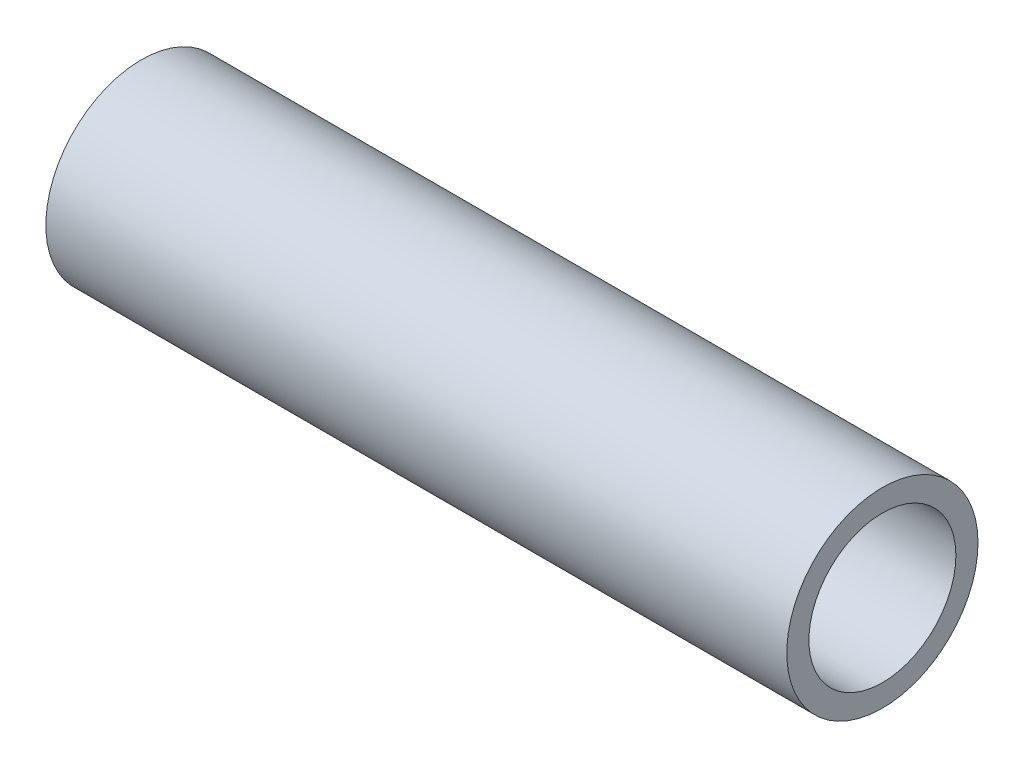
ISO-10303-21;
HEADER;
FILE_DESCRIPTION(('STEP AP214'),'2;1');
FILE_NAME('part.step','',(''),(''),'','','');
FILE_SCHEMA(('AUTOMOTIVE_DESIGN { 1 0 10303 214 1 1 1 1 }'));
ENDSEC;
DATA;
#1=APPLICATION_CONTEXT('core data for automotive mechanical design processes');
#2=APPLICATION_PROTOCOL_DEFINITION('international standard','automotive_design',2000,#1);
#3=PRODUCT_CONTEXT('',#1,'mechanical');
#4=PRODUCT('Part','Part','',(#3));
#5=PRODUCT_RELATED_PRODUCT_CATEGORY('part','',(#4));
#6=PRODUCT_DEFINITION_FORMATION('','',#4);
#7=PRODUCT_DEFINITION_CONTEXT('part definition',#1,'design');
#8=PRODUCT_DEFINITION('design','',#6,#7);
#9=PRODUCT_DEFINITION_SHAPE('','',#8);
#10=(LENGTH_UNIT() NAMED_UNIT(*) SI_UNIT(.MILLI.,.METRE.));
#11=(NAMED_UNIT(*) PLANE_ANGLE_UNIT() SI_UNIT($,.RADIAN.));
#12=(NAMED_UNIT(*) SI_UNIT($,.STERADIAN.) SOLID_ANGLE_UNIT());
#13=UNCERTAINTY_MEASURE_WITH_UNIT(LENGTH_MEASURE(1.E-05),#10,'distance_accuracy_value','');
#14=(GEOMETRIC_REPRESENTATION_CONTEXT(3) GLOBAL_UNCERTAINTY_ASSIGNED_CONTEXT((#13)) GLOBAL_UNIT_ASSIGNED_CONTEXT((#10,
#11,#12)) REPRESENTATION_CONTEXT('',''));
#15=CARTESIAN_POINT('',(0.,0.,0.));
#16=DIRECTION('',(0.,0.,1.));
#17=DIRECTION('',(1.,0.,0.));
#18=AXIS2_PLACEMENT_3D('',#15,#16,#17);
#19=CARTESIAN_POINT('',(62.,0.,0.));
#20=DIRECTION('',(1.,0.,0.));
#21=DIRECTION('',(0.,0.,-1.));
#22=AXIS2_PLACEMENT_3D('',#19,#20,#21);
#23=PLANE('',#22);
#24=CARTESIAN_POINT('',(62.,0.,0.));
#25=DIRECTION('',(1.,0.,0.));
#26=DIRECTION('',(0.,0.,-1.));
#27=AXIS2_PLACEMENT_3D('',#24,#25,#26);
#28=CIRCLE('',#27,8.);
#29=CARTESIAN_POINT('',(62.,0.,-8.));
#30=VERTEX_POINT('',#29);
#31=EDGE_CURVE('E10',#30,#30,#28,.T.);
#32=ORIENTED_EDGE('',*,*,#31,.T.);
#33=EDGE_LOOP('',(#32));
#34=FACE_BOUND('',#33,.T.);
#35=CARTESIAN_POINT('',(62.,0.,0.));
#36=DIRECTION('',(1.,0.,0.));
#37=DIRECTION('',(0.,0.,-1.));
#38=AXIS2_PLACEMENT_3D('',#35,#36,#37);
#39=CIRCLE('',#38,6.15);
#40=CARTESIAN_POINT('',(62.,0.,-6.15));
#41=VERTEX_POINT('',#40);
#42=EDGE_CURVE('E42',#41,#41,#39,.T.);
#43=ORIENTED_EDGE('',*,*,#42,.F.);
#44=EDGE_LOOP('',(#43));
#45=FACE_BOUND('',#44,.T.);
#46=ADVANCED_FACE('F31',(#34,#45),#23,.T.);
#47=CARTESIAN_POINT('',(0.,0.,0.));
#48=DIRECTION('',(1.,0.,0.));
#49=DIRECTION('',(0.,0.,-1.));
#50=AXIS2_PLACEMENT_3D('',#47,#48,#49);
#51=PLANE('',#50);
#52=CARTESIAN_POINT('',(0.,0.,0.));
#53=DIRECTION('',(1.,0.,0.));
#54=DIRECTION('',(0.,0.,-1.));
#55=AXIS2_PLACEMENT_3D('',#52,#53,#54);
#56=CIRCLE('',#55,8.);
#57=CARTESIAN_POINT('',(0.,0.,-8.));
#58=VERTEX_POINT('',#57);
#59=EDGE_CURVE('E35',#58,#58,#56,.T.);
#60=ORIENTED_EDGE('',*,*,#59,.F.);
#61=EDGE_LOOP('',(#60));
#62=FACE_BOUND('',#61,.T.);
#63=CARTESIAN_POINT('',(0.,0.,0.));
#64=DIRECTION('',(1.,0.,0.));
#65=DIRECTION('',(0.,0.,-1.));
#66=AXIS2_PLACEMENT_3D('',#63,#64,#65);
#67=CIRCLE('',#66,6.15);
#68=CARTESIAN_POINT('',(0.,0.,-6.15));
#69=VERTEX_POINT('',#68);
#70=EDGE_CURVE('E44',#69,#69,#67,.T.);
#71=ORIENTED_EDGE('',*,*,#70,.T.);
#72=EDGE_LOOP('',(#71));
#73=FACE_BOUND('',#72,.T.);
#74=ADVANCED_FACE('F54',(#62,#73),#51,.F.);
#75=CARTESIAN_POINT('',(62.,0.,0.));
#76=DIRECTION('',(-1.,0.,0.));
#77=DIRECTION('',(0.,0.,1.));
#78=AXIS2_PLACEMENT_3D('',#75,#76,#77);
#79=CYLINDRICAL_SURFACE('',#78,8.);
#80=ORIENTED_EDGE('',*,*,#31,.F.);
#81=EDGE_LOOP('',(#80));
#82=FACE_BOUND('',#81,.T.);
#83=ORIENTED_EDGE('',*,*,#59,.T.);
#84=EDGE_LOOP('',(#83));
#85=FACE_BOUND('',#84,.T.);
#86=ADVANCED_FACE('F33',(#82,#85),#79,.T.);
#87=CARTESIAN_POINT('',(62.,0.,0.));
#88=DIRECTION('',(-1.,0.,0.));
#89=DIRECTION('',(0.,0.,1.));
#90=AXIS2_PLACEMENT_3D('',#87,#88,#89);
#91=CYLINDRICAL_SURFACE('',#90,6.15);
#92=ORIENTED_EDGE('',*,*,#42,.T.);
#93=EDGE_LOOP('',(#92));
#94=FACE_BOUND('',#93,.T.);
#95=ORIENTED_EDGE('',*,*,#70,.F.);
#96=EDGE_LOOP('',(#95));
#97=FACE_BOUND('',#96,.T.);
#98=ADVANCED_FACE('F50',(#94,#97),#91,.F.);
#99=CLOSED_SHELL('',(#46,#74,#86,#98));
#100=MANIFOLD_SOLID_BREP('B2',#99);
#101=ADVANCED_BREP_SHAPE_REPRESENTATION('',(#18,#100),#14);
#102=SHAPE_DEFINITION_REPRESENTATION(#9,#101);
ENDSEC;
END-ISO-10303-21;
